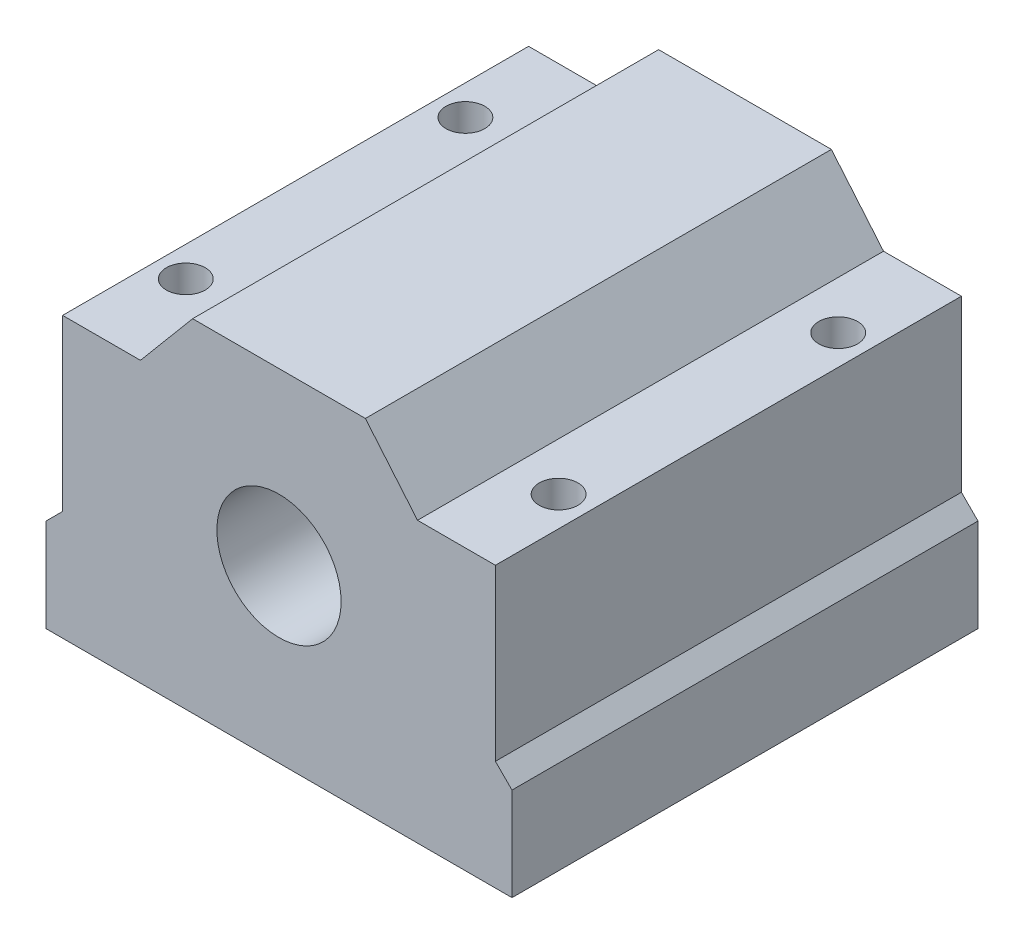
ISO-10303-21;
HEADER;
FILE_DESCRIPTION(('STEP AP214'),'2;1');
FILE_NAME('part.step','',(''),(''),'','','');
FILE_SCHEMA(('AUTOMOTIVE_DESIGN { 1 0 10303 214 1 1 1 1 }'));
ENDSEC;
DATA;
#1=APPLICATION_CONTEXT('core data for automotive mechanical design processes');
#2=APPLICATION_PROTOCOL_DEFINITION('international standard','automotive_design',2000,#1);
#3=PRODUCT_CONTEXT('',#1,'mechanical');
#4=PRODUCT('Part','Part','',(#3));
#5=PRODUCT_RELATED_PRODUCT_CATEGORY('part','',(#4));
#6=PRODUCT_DEFINITION_FORMATION('','',#4);
#7=PRODUCT_DEFINITION_CONTEXT('part definition',#1,'design');
#8=PRODUCT_DEFINITION('design','',#6,#7);
#9=PRODUCT_DEFINITION_SHAPE('','',#8);
#10=(LENGTH_UNIT() NAMED_UNIT(*) SI_UNIT(.MILLI.,.METRE.));
#11=(NAMED_UNIT(*) PLANE_ANGLE_UNIT() SI_UNIT($,.RADIAN.));
#12=(NAMED_UNIT(*) SI_UNIT($,.STERADIAN.) SOLID_ANGLE_UNIT());
#13=UNCERTAINTY_MEASURE_WITH_UNIT(LENGTH_MEASURE(1.E-05),#10,'distance_accuracy_value','');
#14=(GEOMETRIC_REPRESENTATION_CONTEXT(3) GLOBAL_UNCERTAINTY_ASSIGNED_CONTEXT((#13)) GLOBAL_UNIT_ASSIGNED_CONTEXT((#10,
#11,#12)) REPRESENTATION_CONTEXT('',''));
#15=CARTESIAN_POINT('',(0.,0.,0.));
#16=DIRECTION('',(0.,0.,1.));
#17=DIRECTION('',(1.,0.,0.));
#18=AXIS2_PLACEMENT_3D('',#15,#16,#17);
#19=CARTESIAN_POINT('',(-15.,-11.,-30.));
#20=DIRECTION('',(0.,-1.,0.));
#21=DIRECTION('',(0.,0.,-1.));
#22=AXIS2_PLACEMENT_3D('',#19,#20,#21);
#23=PLANE('',#22);
#24=CARTESIAN_POINT('',(-12.,-11.,-24.));
#25=DIRECTION('',(0.,1.,0.));
#26=DIRECTION('',(0.,0.,1.));
#27=AXIS2_PLACEMENT_3D('',#24,#25,#26);
#28=CIRCLE('',#27,1.24999999999998);
#29=CARTESIAN_POINT('',(-12.,-11.,-22.75));
#30=VERTEX_POINT('',#29);
#31=EDGE_CURVE('E460',#30,#30,#28,.T.);
#32=ORIENTED_EDGE('',*,*,#31,.T.);
#33=EDGE_LOOP('',(#32));
#34=FACE_BOUND('',#33,.T.);
#35=CARTESIAN_POINT('',(-12.,-11.,-6.));
#36=DIRECTION('',(0.,1.,0.));
#37=DIRECTION('',(0.,0.,1.));
#38=AXIS2_PLACEMENT_3D('',#35,#36,#37);
#39=CIRCLE('',#38,1.24999999999998);
#40=CARTESIAN_POINT('',(-12.,-11.,-4.75000000000002));
#41=VERTEX_POINT('',#40);
#42=EDGE_CURVE('E473',#41,#41,#39,.T.);
#43=ORIENTED_EDGE('',*,*,#42,.T.);
#44=EDGE_LOOP('',(#43));
#45=FACE_BOUND('',#44,.T.);
#46=CARTESIAN_POINT('',(12.,-11.,-6.));
#47=DIRECTION('',(0.,1.,0.));
#48=DIRECTION('',(0.,0.,1.));
#49=AXIS2_PLACEMENT_3D('',#46,#47,#48);
#50=CIRCLE('',#49,1.24999999999998);
#51=CARTESIAN_POINT('',(12.,-11.,-4.75000000000002));
#52=VERTEX_POINT('',#51);
#53=EDGE_CURVE('E481',#52,#52,#50,.T.);
#54=ORIENTED_EDGE('',*,*,#53,.T.);
#55=EDGE_LOOP('',(#54));
#56=FACE_BOUND('',#55,.T.);
#57=DIRECTION('',(1.,0.,0.));
#58=VECTOR('',#57,1.);
#59=CARTESIAN_POINT('',(-15.,-11.,0.));
#60=LINE('',#59,#58);
#61=CARTESIAN_POINT('',(-15.,-11.,0.));
#62=VERTEX_POINT('',#61);
#63=CARTESIAN_POINT('',(15.,-11.,0.));
#64=VERTEX_POINT('',#63);
#65=EDGE_CURVE('E180',#62,#64,#60,.T.);
#66=ORIENTED_EDGE('',*,*,#65,.F.);
#67=DIRECTION('',(0.,0.,1.));
#68=VECTOR('',#67,1.);
#69=CARTESIAN_POINT('',(-15.,-11.,-30.));
#70=LINE('',#69,#68);
#71=CARTESIAN_POINT('',(-15.,-11.,-30.));
#72=VERTEX_POINT('',#71);
#73=EDGE_CURVE('E239',#72,#62,#70,.T.);
#74=ORIENTED_EDGE('',*,*,#73,.F.);
#75=DIRECTION('',(1.,0.,0.));
#76=VECTOR('',#75,1.);
#77=CARTESIAN_POINT('',(-15.,-11.,-30.));
#78=LINE('',#77,#76);
#79=CARTESIAN_POINT('',(15.,-11.,-30.));
#80=VERTEX_POINT('',#79);
#81=EDGE_CURVE('E288',#72,#80,#78,.T.);
#82=ORIENTED_EDGE('',*,*,#81,.T.);
#83=DIRECTION('',(0.,0.,1.));
#84=VECTOR('',#83,1.);
#85=CARTESIAN_POINT('',(15.,-11.,-30.));
#86=LINE('',#85,#84);
#87=EDGE_CURVE('E237',#80,#64,#86,.T.);
#88=ORIENTED_EDGE('',*,*,#87,.T.);
#89=EDGE_LOOP('',(#66,#74,#82,#88));
#90=FACE_BOUND('',#89,.T.);
#91=CARTESIAN_POINT('',(12.,-11.,-24.));
#92=DIRECTION('',(0.,1.,0.));
#93=DIRECTION('',(0.,0.,1.));
#94=AXIS2_PLACEMENT_3D('',#91,#92,#93);
#95=CIRCLE('',#94,1.24999999999998);
#96=CARTESIAN_POINT('',(12.,-11.,-22.75));
#97=VERTEX_POINT('',#96);
#98=EDGE_CURVE('E489',#97,#97,#95,.T.);
#99=ORIENTED_EDGE('',*,*,#98,.T.);
#100=EDGE_LOOP('',(#99));
#101=FACE_BOUND('',#100,.T.);
#102=ADVANCED_FACE('F43',(#34,#45,#56,#90,#101),#23,.T.);
#103=CARTESIAN_POINT('',(-15.,-5.,-30.));
#104=DIRECTION('',(-0.707106781186547,0.707106781186548,0.));
#105=DIRECTION('',(-0.707106781186548,-0.707106781186547,0.));
#106=AXIS2_PLACEMENT_3D('',#103,#104,#105);
#107=PLANE('',#106);
#108=DIRECTION('',(-0.707106781186548,-0.707106781186547,0.));
#109=VECTOR('',#108,1.);
#110=CARTESIAN_POINT('',(-15.,-5.,0.));
#111=LINE('',#110,#109);
#112=CARTESIAN_POINT('',(-13.9316916397758,-3.93169163977581,0.));
#113=VERTEX_POINT('',#112);
#114=CARTESIAN_POINT('',(-15.,-5.,0.));
#115=VERTEX_POINT('',#114);
#116=EDGE_CURVE('E171',#113,#115,#111,.T.);
#117=ORIENTED_EDGE('',*,*,#116,.F.);
#118=DIRECTION('',(0.,0.,1.));
#119=VECTOR('',#118,1.);
#120=CARTESIAN_POINT('',(-13.9316916397758,-3.93169163977581,-30.));
#121=LINE('',#120,#119);
#122=CARTESIAN_POINT('',(-13.9316916397758,-3.93169163977581,-30.));
#123=VERTEX_POINT('',#122);
#124=EDGE_CURVE('E11',#123,#113,#121,.T.);
#125=ORIENTED_EDGE('',*,*,#124,.F.);
#126=DIRECTION('',(-0.707106781186548,-0.707106781186547,0.));
#127=VECTOR('',#126,1.);
#128=CARTESIAN_POINT('',(-15.,-5.,-30.));
#129=LINE('',#128,#127);
#130=CARTESIAN_POINT('',(-15.,-5.,-30.));
#131=VERTEX_POINT('',#130);
#132=EDGE_CURVE('E216',#123,#131,#129,.T.);
#133=ORIENTED_EDGE('',*,*,#132,.T.);
#134=DIRECTION('',(0.,0.,1.));
#135=VECTOR('',#134,1.);
#136=CARTESIAN_POINT('',(-15.,-5.,-30.));
#137=LINE('',#136,#135);
#138=EDGE_CURVE('E47',#131,#115,#137,.T.);
#139=ORIENTED_EDGE('',*,*,#138,.T.);
#140=EDGE_LOOP('',(#117,#125,#133,#139));
#141=FACE_BOUND('',#140,.T.);
#142=ADVANCED_FACE('F45',(#141),#107,.T.);
#143=CARTESIAN_POINT('',(-13.9316916397758,-3.93169163977581,-30.));
#144=DIRECTION('',(-1.,0.,0.));
#145=DIRECTION('',(0.,0.,1.));
#146=AXIS2_PLACEMENT_3D('',#143,#144,#145);
#147=PLANE('',#146);
#148=DIRECTION('',(0.,-1.,0.));
#149=VECTOR('',#148,1.);
#150=CARTESIAN_POINT('',(-13.9316916397758,-3.93169163977581,0.));
#151=LINE('',#150,#149);
#152=CARTESIAN_POINT('',(-13.9316916397758,7.,0.));
#153=VERTEX_POINT('',#152);
#154=EDGE_CURVE('E213',#153,#113,#151,.T.);
#155=ORIENTED_EDGE('',*,*,#154,.F.);
#156=DIRECTION('',(0.,0.,1.));
#157=VECTOR('',#156,1.);
#158=CARTESIAN_POINT('',(-13.9316916397758,7.,-30.));
#159=LINE('',#158,#157);
#160=CARTESIAN_POINT('',(-13.9316916397758,7.,-30.));
#161=VERTEX_POINT('',#160);
#162=EDGE_CURVE('E54',#161,#153,#159,.T.);
#163=ORIENTED_EDGE('',*,*,#162,.F.);
#164=DIRECTION('',(0.,-1.,0.));
#165=VECTOR('',#164,1.);
#166=CARTESIAN_POINT('',(-13.9316916397758,-3.93169163977581,-30.));
#167=LINE('',#166,#165);
#168=EDGE_CURVE('E157',#161,#123,#167,.T.);
#169=ORIENTED_EDGE('',*,*,#168,.T.);
#170=ORIENTED_EDGE('',*,*,#124,.T.);
#171=EDGE_LOOP('',(#155,#163,#169,#170));
#172=FACE_BOUND('',#171,.T.);
#173=ADVANCED_FACE('F246',(#172),#147,.T.);
#174=CARTESIAN_POINT('',(-13.9316916397758,7.,-30.));
#175=DIRECTION('',(0.,1.,0.));
#176=DIRECTION('',(-1.,0.,0.));
#177=AXIS2_PLACEMENT_3D('',#174,#175,#176);
#178=PLANE('',#177);
#179=CARTESIAN_POINT('',(-12.,7.,-24.));
#180=DIRECTION('',(0.,1.,0.));
#181=DIRECTION('',(0.,0.,1.));
#182=AXIS2_PLACEMENT_3D('',#179,#180,#181);
#183=CIRCLE('',#182,1.24999999999999);
#184=CARTESIAN_POINT('',(-12.,7.,-22.75));
#185=VERTEX_POINT('',#184);
#186=EDGE_CURVE('E463',#185,#185,#183,.T.);
#187=ORIENTED_EDGE('',*,*,#186,.F.);
#188=EDGE_LOOP('',(#187));
#189=FACE_BOUND('',#188,.T.);
#190=CARTESIAN_POINT('',(-12.,7.,-6.));
#191=DIRECTION('',(0.,1.,0.));
#192=DIRECTION('',(0.,0.,1.));
#193=AXIS2_PLACEMENT_3D('',#190,#191,#192);
#194=CIRCLE('',#193,1.24999999999999);
#195=CARTESIAN_POINT('',(-12.,7.,-4.75000000000001));
#196=VERTEX_POINT('',#195);
#197=EDGE_CURVE('E467',#196,#196,#194,.T.);
#198=ORIENTED_EDGE('',*,*,#197,.F.);
#199=EDGE_LOOP('',(#198));
#200=FACE_BOUND('',#199,.T.);
#201=DIRECTION('',(-1.,0.,0.));
#202=VECTOR('',#201,1.);
#203=CARTESIAN_POINT('',(-13.9316916397758,7.,0.));
#204=LINE('',#203,#202);
#205=CARTESIAN_POINT('',(-8.91767979477107,7.,0.));
#206=VERTEX_POINT('',#205);
#207=EDGE_CURVE('E143',#206,#153,#204,.T.);
#208=ORIENTED_EDGE('',*,*,#207,.F.);
#209=DIRECTION('',(0.,0.,1.));
#210=VECTOR('',#209,1.);
#211=CARTESIAN_POINT('',(-8.91767979477107,7.,-30.));
#212=LINE('',#211,#210);
#213=CARTESIAN_POINT('',(-8.91767979477107,7.,-30.));
#214=VERTEX_POINT('',#213);
#215=EDGE_CURVE('E138',#214,#206,#212,.T.);
#216=ORIENTED_EDGE('',*,*,#215,.F.);
#217=DIRECTION('',(-1.,0.,0.));
#218=VECTOR('',#217,1.);
#219=CARTESIAN_POINT('',(-13.9316916397758,7.,-30.));
#220=LINE('',#219,#218);
#221=EDGE_CURVE('E141',#214,#161,#220,.T.);
#222=ORIENTED_EDGE('',*,*,#221,.T.);
#223=ORIENTED_EDGE('',*,*,#162,.T.);
#224=EDGE_LOOP('',(#208,#216,#222,#223));
#225=FACE_BOUND('',#224,.T.);
#226=ADVANCED_FACE('F140',(#189,#200,#225),#178,.T.);
#227=CARTESIAN_POINT('',(-8.91767979477107,7.,-30.));
#228=DIRECTION('',(-0.766044443118979,0.642787609686538,0.));
#229=DIRECTION('',(-0.642787609686538,-0.766044443118979,0.));
#230=AXIS2_PLACEMENT_3D('',#227,#228,#229);
#231=PLANE('',#230);
#232=DIRECTION('',(-0.642787609686538,-0.766044443118979,0.));
#233=VECTOR('',#232,1.);
#234=CARTESIAN_POINT('',(-8.91767979477107,7.,0.));
#235=LINE('',#234,#233);
#236=CARTESIAN_POINT('',(-5.56128127006196,11.,0.));
#237=VERTEX_POINT('',#236);
#238=EDGE_CURVE('E208',#237,#206,#235,.T.);
#239=ORIENTED_EDGE('',*,*,#238,.F.);
#240=DIRECTION('',(0.,0.,1.));
#241=VECTOR('',#240,1.);
#242=CARTESIAN_POINT('',(-5.56128127006196,11.,-30.));
#243=LINE('',#242,#241);
#244=CARTESIAN_POINT('',(-5.56128127006196,11.,-30.));
#245=VERTEX_POINT('',#244);
#246=EDGE_CURVE('E149',#245,#237,#243,.T.);
#247=ORIENTED_EDGE('',*,*,#246,.F.);
#248=DIRECTION('',(-0.642787609686538,-0.766044443118979,0.));
#249=VECTOR('',#248,1.);
#250=CARTESIAN_POINT('',(-8.91767979477107,7.,-30.));
#251=LINE('',#250,#249);
#252=EDGE_CURVE('E155',#245,#214,#251,.T.);
#253=ORIENTED_EDGE('',*,*,#252,.T.);
#254=ORIENTED_EDGE('',*,*,#215,.T.);
#255=EDGE_LOOP('',(#239,#247,#253,#254));
#256=FACE_BOUND('',#255,.T.);
#257=ADVANCED_FACE('F160',(#256),#231,.T.);
#258=CARTESIAN_POINT('',(5.56128127006196,11.,-30.));
#259=DIRECTION('',(0.,1.,0.));
#260=DIRECTION('',(0.,0.,1.));
#261=AXIS2_PLACEMENT_3D('',#258,#259,#260);
#262=PLANE('',#261);
#263=DIRECTION('',(-1.,0.,0.));
#264=VECTOR('',#263,1.);
#265=CARTESIAN_POINT('',(5.56128127006196,11.,0.));
#266=LINE('',#265,#264);
#267=CARTESIAN_POINT('',(5.56128127006196,11.,0.));
#268=VERTEX_POINT('',#267);
#269=EDGE_CURVE('E204',#268,#237,#266,.T.);
#270=ORIENTED_EDGE('',*,*,#269,.F.);
#271=DIRECTION('',(0.,0.,1.));
#272=VECTOR('',#271,1.);
#273=CARTESIAN_POINT('',(5.56128127006196,11.,-30.));
#274=LINE('',#273,#272);
#275=CARTESIAN_POINT('',(5.56128127006196,11.,-30.));
#276=VERTEX_POINT('',#275);
#277=EDGE_CURVE('E222',#276,#268,#274,.T.);
#278=ORIENTED_EDGE('',*,*,#277,.F.);
#279=DIRECTION('',(-1.,0.,0.));
#280=VECTOR('',#279,1.);
#281=CARTESIAN_POINT('',(5.56128127006196,11.,-30.));
#282=LINE('',#281,#280);
#283=EDGE_CURVE('E162',#276,#245,#282,.T.);
#284=ORIENTED_EDGE('',*,*,#283,.T.);
#285=ORIENTED_EDGE('',*,*,#246,.T.);
#286=EDGE_LOOP('',(#270,#278,#284,#285));
#287=FACE_BOUND('',#286,.T.);
#288=ADVANCED_FACE('F326',(#287),#262,.T.);
#289=CARTESIAN_POINT('',(8.91767979477107,7.,-30.));
#290=DIRECTION('',(0.766044443118979,0.642787609686538,0.));
#291=DIRECTION('',(-0.642787609686538,0.766044443118979,0.));
#292=AXIS2_PLACEMENT_3D('',#289,#290,#291);
#293=PLANE('',#292);
#294=DIRECTION('',(-0.642787609686538,0.766044443118979,0.));
#295=VECTOR('',#294,1.);
#296=CARTESIAN_POINT('',(8.91767979477107,7.,0.));
#297=LINE('',#296,#295);
#298=CARTESIAN_POINT('',(8.91767979477107,7.,0.));
#299=VERTEX_POINT('',#298);
#300=EDGE_CURVE('E200',#299,#268,#297,.T.);
#301=ORIENTED_EDGE('',*,*,#300,.F.);
#302=DIRECTION('',(0.,0.,1.));
#303=VECTOR('',#302,1.);
#304=CARTESIAN_POINT('',(8.91767979477107,7.,-30.));
#305=LINE('',#304,#303);
#306=CARTESIAN_POINT('',(8.91767979477107,7.,-30.));
#307=VERTEX_POINT('',#306);
#308=EDGE_CURVE('E225',#307,#299,#305,.T.);
#309=ORIENTED_EDGE('',*,*,#308,.F.);
#310=DIRECTION('',(-0.642787609686538,0.766044443118979,0.));
#311=VECTOR('',#310,1.);
#312=CARTESIAN_POINT('',(8.91767979477107,7.,-30.));
#313=LINE('',#312,#311);
#314=EDGE_CURVE('E165',#307,#276,#313,.T.);
#315=ORIENTED_EDGE('',*,*,#314,.T.);
#316=ORIENTED_EDGE('',*,*,#277,.T.);
#317=EDGE_LOOP('',(#301,#309,#315,#316));
#318=FACE_BOUND('',#317,.T.);
#319=ADVANCED_FACE('F315',(#318),#293,.T.);
#320=CARTESIAN_POINT('',(13.9316916397758,7.,-30.));
#321=DIRECTION('',(0.,1.,0.));
#322=DIRECTION('',(-1.,0.,0.));
#323=AXIS2_PLACEMENT_3D('',#320,#321,#322);
#324=PLANE('',#323);
#325=CARTESIAN_POINT('',(12.,6.99999999999999,-6.));
#326=DIRECTION('',(0.,1.,0.));
#327=DIRECTION('',(0.,0.,1.));
#328=AXIS2_PLACEMENT_3D('',#325,#326,#327);
#329=CIRCLE('',#328,1.24999999999999);
#330=CARTESIAN_POINT('',(12.,6.99999999999999,-4.75000000000001));
#331=VERTEX_POINT('',#330);
#332=EDGE_CURVE('E477',#331,#331,#329,.T.);
#333=ORIENTED_EDGE('',*,*,#332,.F.);
#334=EDGE_LOOP('',(#333));
#335=FACE_BOUND('',#334,.T.);
#336=CARTESIAN_POINT('',(12.,6.99999999999999,-24.));
#337=DIRECTION('',(0.,1.,0.));
#338=DIRECTION('',(0.,0.,1.));
#339=AXIS2_PLACEMENT_3D('',#336,#337,#338);
#340=CIRCLE('',#339,1.24999999999999);
#341=CARTESIAN_POINT('',(12.,6.99999999999999,-22.75));
#342=VERTEX_POINT('',#341);
#343=EDGE_CURVE('E485',#342,#342,#340,.T.);
#344=ORIENTED_EDGE('',*,*,#343,.F.);
#345=EDGE_LOOP('',(#344));
#346=FACE_BOUND('',#345,.T.);
#347=DIRECTION('',(-1.,0.,0.));
#348=VECTOR('',#347,1.);
#349=CARTESIAN_POINT('',(13.9316916397758,7.,0.));
#350=LINE('',#349,#348);
#351=CARTESIAN_POINT('',(13.9316916397758,7.,0.));
#352=VERTEX_POINT('',#351);
#353=EDGE_CURVE('E196',#352,#299,#350,.T.);
#354=ORIENTED_EDGE('',*,*,#353,.F.);
#355=DIRECTION('',(0.,0.,1.));
#356=VECTOR('',#355,1.);
#357=CARTESIAN_POINT('',(13.9316916397758,7.,-30.));
#358=LINE('',#357,#356);
#359=CARTESIAN_POINT('',(13.9316916397758,7.,-30.));
#360=VERTEX_POINT('',#359);
#361=EDGE_CURVE('E228',#360,#352,#358,.T.);
#362=ORIENTED_EDGE('',*,*,#361,.F.);
#363=DIRECTION('',(-1.,0.,0.));
#364=VECTOR('',#363,1.);
#365=CARTESIAN_POINT('',(13.9316916397758,7.,-30.));
#366=LINE('',#365,#364);
#367=EDGE_CURVE('E307',#360,#307,#366,.T.);
#368=ORIENTED_EDGE('',*,*,#367,.T.);
#369=ORIENTED_EDGE('',*,*,#308,.T.);
#370=EDGE_LOOP('',(#354,#362,#368,#369));
#371=FACE_BOUND('',#370,.T.);
#372=ADVANCED_FACE('F321',(#335,#346,#371),#324,.T.);
#373=CARTESIAN_POINT('',(13.9316916397758,-3.93169163977581,-30.));
#374=DIRECTION('',(1.,0.,0.));
#375=DIRECTION('',(0.,0.,-1.));
#376=AXIS2_PLACEMENT_3D('',#373,#374,#375);
#377=PLANE('',#376);
#378=DIRECTION('',(0.,1.,0.));
#379=VECTOR('',#378,1.);
#380=CARTESIAN_POINT('',(13.9316916397758,-3.93169163977581,0.));
#381=LINE('',#380,#379);
#382=CARTESIAN_POINT('',(13.9316916397758,-3.93169163977581,0.));
#383=VERTEX_POINT('',#382);
#384=EDGE_CURVE('E192',#383,#352,#381,.T.);
#385=ORIENTED_EDGE('',*,*,#384,.F.);
#386=DIRECTION('',(0.,0.,1.));
#387=VECTOR('',#386,1.);
#388=CARTESIAN_POINT('',(13.9316916397758,-3.93169163977581,-30.));
#389=LINE('',#388,#387);
#390=CARTESIAN_POINT('',(13.9316916397758,-3.93169163977581,-30.));
#391=VERTEX_POINT('',#390);
#392=EDGE_CURVE('E231',#391,#383,#389,.T.);
#393=ORIENTED_EDGE('',*,*,#392,.F.);
#394=DIRECTION('',(0.,1.,0.));
#395=VECTOR('',#394,1.);
#396=CARTESIAN_POINT('',(13.9316916397758,-3.93169163977581,-30.));
#397=LINE('',#396,#395);
#398=EDGE_CURVE('E303',#391,#360,#397,.T.);
#399=ORIENTED_EDGE('',*,*,#398,.T.);
#400=ORIENTED_EDGE('',*,*,#361,.T.);
#401=EDGE_LOOP('',(#385,#393,#399,#400));
#402=FACE_BOUND('',#401,.T.);
#403=ADVANCED_FACE('F278',(#402),#377,.T.);
#404=CARTESIAN_POINT('',(15.,-5.,-30.));
#405=DIRECTION('',(0.707106781186547,0.707106781186548,0.));
#406=DIRECTION('',(-0.707106781186548,0.707106781186547,0.));
#407=AXIS2_PLACEMENT_3D('',#404,#405,#406);
#408=PLANE('',#407);
#409=DIRECTION('',(-0.707106781186548,0.707106781186547,0.));
#410=VECTOR('',#409,1.);
#411=CARTESIAN_POINT('',(15.,-5.,0.));
#412=LINE('',#411,#410);
#413=CARTESIAN_POINT('',(15.,-5.,0.));
#414=VERTEX_POINT('',#413);
#415=EDGE_CURVE('E188',#414,#383,#412,.T.);
#416=ORIENTED_EDGE('',*,*,#415,.F.);
#417=DIRECTION('',(0.,0.,1.));
#418=VECTOR('',#417,1.);
#419=CARTESIAN_POINT('',(15.,-5.,-30.));
#420=LINE('',#419,#418);
#421=CARTESIAN_POINT('',(15.,-5.,-30.));
#422=VERTEX_POINT('',#421);
#423=EDGE_CURVE('E234',#422,#414,#420,.T.);
#424=ORIENTED_EDGE('',*,*,#423,.F.);
#425=DIRECTION('',(-0.707106781186548,0.707106781186547,0.));
#426=VECTOR('',#425,1.);
#427=CARTESIAN_POINT('',(15.,-5.,-30.));
#428=LINE('',#427,#426);
#429=EDGE_CURVE('E295',#422,#391,#428,.T.);
#430=ORIENTED_EDGE('',*,*,#429,.T.);
#431=ORIENTED_EDGE('',*,*,#392,.T.);
#432=EDGE_LOOP('',(#416,#424,#430,#431));
#433=FACE_BOUND('',#432,.T.);
#434=ADVANCED_FACE('F273',(#433),#408,.T.);
#435=CARTESIAN_POINT('',(15.,-11.,-30.));
#436=DIRECTION('',(1.,0.,0.));
#437=DIRECTION('',(0.,0.,-1.));
#438=AXIS2_PLACEMENT_3D('',#435,#436,#437);
#439=PLANE('',#438);
#440=DIRECTION('',(0.,1.,0.));
#441=VECTOR('',#440,1.);
#442=CARTESIAN_POINT('',(15.,-11.,0.));
#443=LINE('',#442,#441);
#444=EDGE_CURVE('E184',#64,#414,#443,.T.);
#445=ORIENTED_EDGE('',*,*,#444,.F.);
#446=ORIENTED_EDGE('',*,*,#87,.F.);
#447=DIRECTION('',(0.,1.,0.));
#448=VECTOR('',#447,1.);
#449=CARTESIAN_POINT('',(15.,-11.,-30.));
#450=LINE('',#449,#448);
#451=EDGE_CURVE('E290',#80,#422,#450,.T.);
#452=ORIENTED_EDGE('',*,*,#451,.T.);
#453=ORIENTED_EDGE('',*,*,#423,.T.);
#454=EDGE_LOOP('',(#445,#446,#452,#453));
#455=FACE_BOUND('',#454,.T.);
#456=ADVANCED_FACE('F264',(#455),#439,.T.);
#457=CARTESIAN_POINT('',(-15.,-11.,-30.));
#458=DIRECTION('',(-1.,0.,0.));
#459=DIRECTION('',(0.,0.,1.));
#460=AXIS2_PLACEMENT_3D('',#457,#458,#459);
#461=PLANE('',#460);
#462=DIRECTION('',(0.,-1.,0.));
#463=VECTOR('',#462,1.);
#464=CARTESIAN_POINT('',(-15.,-11.,0.));
#465=LINE('',#464,#463);
#466=EDGE_CURVE('E175',#115,#62,#465,.T.);
#467=ORIENTED_EDGE('',*,*,#466,.F.);
#468=ORIENTED_EDGE('',*,*,#138,.F.);
#469=DIRECTION('',(0.,-1.,0.));
#470=VECTOR('',#469,1.);
#471=CARTESIAN_POINT('',(-15.,-11.,-30.));
#472=LINE('',#471,#470);
#473=EDGE_CURVE('E291',#131,#72,#472,.T.);
#474=ORIENTED_EDGE('',*,*,#473,.T.);
#475=ORIENTED_EDGE('',*,*,#73,.T.);
#476=EDGE_LOOP('',(#467,#468,#474,#475));
#477=FACE_BOUND('',#476,.T.);
#478=ADVANCED_FACE('F243',(#477),#461,.T.);
#479=CARTESIAN_POINT('',(0.,0.,-30.));
#480=DIRECTION('',(0.,0.,1.));
#481=DIRECTION('',(1.,0.,0.));
#482=AXIS2_PLACEMENT_3D('',#479,#480,#481);
#483=PLANE('',#482);
#484=CARTESIAN_POINT('',(0.,0.,-30.));
#485=DIRECTION('',(0.,0.,1.));
#486=DIRECTION('',(1.,0.,0.));
#487=AXIS2_PLACEMENT_3D('',#484,#485,#486);
#488=CIRCLE('',#487,4.);
#489=CARTESIAN_POINT('',(4.,0.,-30.));
#490=VERTEX_POINT('',#489);
#491=EDGE_CURVE('E176',#490,#490,#488,.T.);
#492=ORIENTED_EDGE('',*,*,#491,.T.);
#493=EDGE_LOOP('',(#492));
#494=FACE_BOUND('',#493,.T.);
#495=ORIENTED_EDGE('',*,*,#132,.F.);
#496=ORIENTED_EDGE('',*,*,#168,.F.);
#497=ORIENTED_EDGE('',*,*,#221,.F.);
#498=ORIENTED_EDGE('',*,*,#252,.F.);
#499=ORIENTED_EDGE('',*,*,#283,.F.);
#500=ORIENTED_EDGE('',*,*,#314,.F.);
#501=ORIENTED_EDGE('',*,*,#367,.F.);
#502=ORIENTED_EDGE('',*,*,#398,.F.);
#503=ORIENTED_EDGE('',*,*,#429,.F.);
#504=ORIENTED_EDGE('',*,*,#451,.F.);
#505=ORIENTED_EDGE('',*,*,#81,.F.);
#506=ORIENTED_EDGE('',*,*,#473,.F.);
#507=EDGE_LOOP('',(#495,#496,#497,#498,#499,#500,#501,#502,#503,#504,#505,#506));
#508=FACE_BOUND('',#507,.T.);
#509=ADVANCED_FACE('F153',(#494,#508),#483,.F.);
#510=CARTESIAN_POINT('',(0.,0.,0.));
#511=DIRECTION('',(0.,0.,1.));
#512=DIRECTION('',(1.,0.,0.));
#513=AXIS2_PLACEMENT_3D('',#510,#511,#512);
#514=PLANE('',#513);
#515=CARTESIAN_POINT('',(0.,0.,0.));
#516=DIRECTION('',(0.,0.,1.));
#517=DIRECTION('',(1.,0.,0.));
#518=AXIS2_PLACEMENT_3D('',#515,#516,#517);
#519=CIRCLE('',#518,4.);
#520=CARTESIAN_POINT('',(4.,0.,0.));
#521=VERTEX_POINT('',#520);
#522=EDGE_CURVE('E493',#521,#521,#519,.T.);
#523=ORIENTED_EDGE('',*,*,#522,.F.);
#524=EDGE_LOOP('',(#523));
#525=FACE_BOUND('',#524,.T.);
#526=ORIENTED_EDGE('',*,*,#116,.T.);
#527=ORIENTED_EDGE('',*,*,#466,.T.);
#528=ORIENTED_EDGE('',*,*,#65,.T.);
#529=ORIENTED_EDGE('',*,*,#444,.T.);
#530=ORIENTED_EDGE('',*,*,#415,.T.);
#531=ORIENTED_EDGE('',*,*,#384,.T.);
#532=ORIENTED_EDGE('',*,*,#353,.T.);
#533=ORIENTED_EDGE('',*,*,#300,.T.);
#534=ORIENTED_EDGE('',*,*,#269,.T.);
#535=ORIENTED_EDGE('',*,*,#238,.T.);
#536=ORIENTED_EDGE('',*,*,#207,.T.);
#537=ORIENTED_EDGE('',*,*,#154,.T.);
#538=EDGE_LOOP('',(#526,#527,#528,#529,#530,#531,#532,#533,#534,#535,#536,#537));
#539=FACE_BOUND('',#538,.T.);
#540=ADVANCED_FACE('F245',(#525,#539),#514,.T.);
#541=CARTESIAN_POINT('',(0.,0.,-30.));
#542=DIRECTION('',(0.,0.,1.));
#543=DIRECTION('',(1.,0.,0.));
#544=AXIS2_PLACEMENT_3D('',#541,#542,#543);
#545=CYLINDRICAL_SURFACE('',#544,4.);
#546=ORIENTED_EDGE('',*,*,#491,.F.);
#547=EDGE_LOOP('',(#546));
#548=FACE_BOUND('',#547,.T.);
#549=ORIENTED_EDGE('',*,*,#522,.T.);
#550=EDGE_LOOP('',(#549));
#551=FACE_BOUND('',#550,.T.);
#552=ADVANCED_FACE('F376',(#548,#551),#545,.F.);
#553=CARTESIAN_POINT('',(12.,6.99999999999999,-24.));
#554=DIRECTION('',(0.,1.,0.));
#555=DIRECTION('',(0.,0.,1.));
#556=AXIS2_PLACEMENT_3D('',#553,#554,#555);
#557=CYLINDRICAL_SURFACE('',#556,1.24999999999999);
#558=ORIENTED_EDGE('',*,*,#98,.F.);
#559=EDGE_LOOP('',(#558));
#560=FACE_BOUND('',#559,.T.);
#561=ORIENTED_EDGE('',*,*,#343,.T.);
#562=EDGE_LOOP('',(#561));
#563=FACE_BOUND('',#562,.T.);
#564=ADVANCED_FACE('F385',(#560,#563),#557,.F.);
#565=CARTESIAN_POINT('',(12.,6.99999999999999,-6.));
#566=DIRECTION('',(0.,1.,0.));
#567=DIRECTION('',(0.,0.,1.));
#568=AXIS2_PLACEMENT_3D('',#565,#566,#567);
#569=CYLINDRICAL_SURFACE('',#568,1.24999999999999);
#570=ORIENTED_EDGE('',*,*,#53,.F.);
#571=EDGE_LOOP('',(#570));
#572=FACE_BOUND('',#571,.T.);
#573=ORIENTED_EDGE('',*,*,#332,.T.);
#574=EDGE_LOOP('',(#573));
#575=FACE_BOUND('',#574,.T.);
#576=ADVANCED_FACE('F417',(#572,#575),#569,.F.);
#577=CARTESIAN_POINT('',(-12.,7.,-6.));
#578=DIRECTION('',(0.,1.,0.));
#579=DIRECTION('',(0.,0.,1.));
#580=AXIS2_PLACEMENT_3D('',#577,#578,#579);
#581=CYLINDRICAL_SURFACE('',#580,1.24999999999999);
#582=ORIENTED_EDGE('',*,*,#42,.F.);
#583=EDGE_LOOP('',(#582));
#584=FACE_BOUND('',#583,.T.);
#585=ORIENTED_EDGE('',*,*,#197,.T.);
#586=EDGE_LOOP('',(#585));
#587=FACE_BOUND('',#586,.T.);
#588=ADVANCED_FACE('F427',(#584,#587),#581,.F.);
#589=CARTESIAN_POINT('',(-12.,7.,-24.));
#590=DIRECTION('',(0.,1.,0.));
#591=DIRECTION('',(0.,0.,1.));
#592=AXIS2_PLACEMENT_3D('',#589,#590,#591);
#593=CYLINDRICAL_SURFACE('',#592,1.24999999999999);
#594=ORIENTED_EDGE('',*,*,#31,.F.);
#595=EDGE_LOOP('',(#594));
#596=FACE_BOUND('',#595,.T.);
#597=ORIENTED_EDGE('',*,*,#186,.T.);
#598=EDGE_LOOP('',(#597));
#599=FACE_BOUND('',#598,.T.);
#600=ADVANCED_FACE('F438',(#596,#599),#593,.F.);
#601=CLOSED_SHELL('',(#102,#142,#173,#226,#257,#288,#319,#372,#403,#434,#456,#478,#509,#540,
#552,#564,#576,#588,#600));
#602=MANIFOLD_SOLID_BREP('B2',#601);
#603=ADVANCED_BREP_SHAPE_REPRESENTATION('',(#18,#602),#14);
#604=SHAPE_DEFINITION_REPRESENTATION(#9,#603);
ENDSEC;
END-ISO-10303-21;
